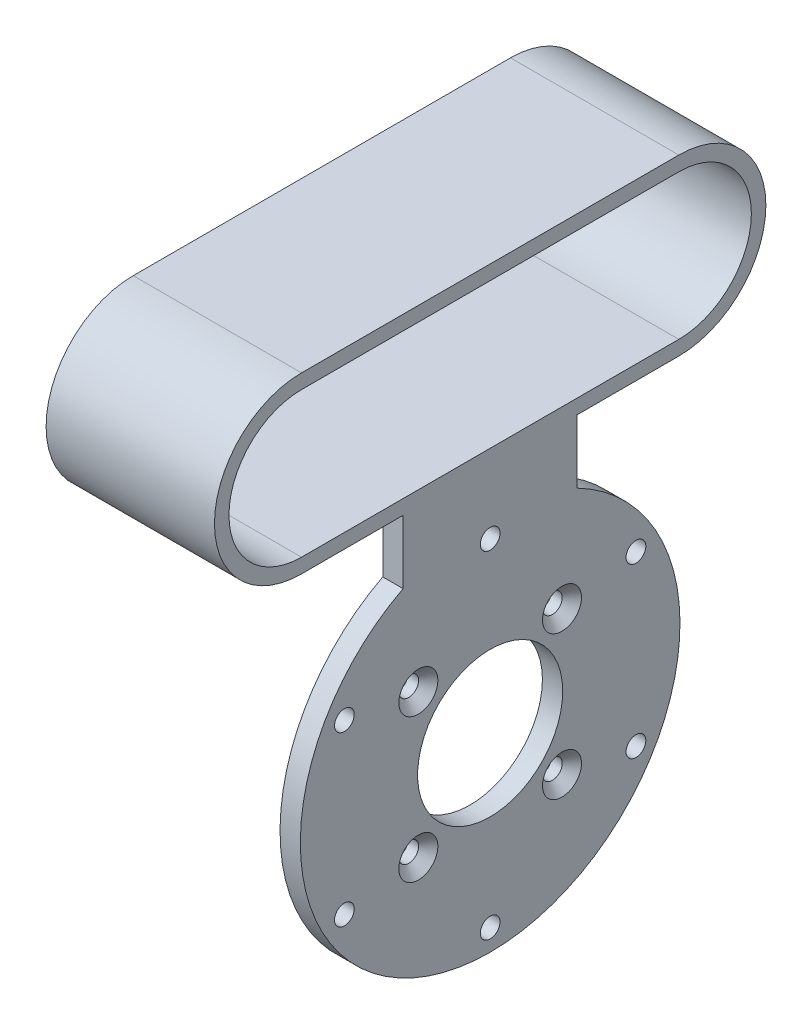
ISO-10303-21;
HEADER;
FILE_DESCRIPTION(('STEP AP214'),'2;1');
FILE_NAME('part.step','',(''),(''),'','','');
FILE_SCHEMA(('AUTOMOTIVE_DESIGN { 1 0 10303 214 1 1 1 1 }'));
ENDSEC;
DATA;
#1=APPLICATION_CONTEXT('core data for automotive mechanical design processes');
#2=APPLICATION_PROTOCOL_DEFINITION('international standard','automotive_design',2000,#1);
#3=PRODUCT_CONTEXT('',#1,'mechanical');
#4=PRODUCT('Part','Part','',(#3));
#5=PRODUCT_RELATED_PRODUCT_CATEGORY('part','',(#4));
#6=PRODUCT_DEFINITION_FORMATION('','',#4);
#7=PRODUCT_DEFINITION_CONTEXT('part definition',#1,'design');
#8=PRODUCT_DEFINITION('design','',#6,#7);
#9=PRODUCT_DEFINITION_SHAPE('','',#8);
#10=(LENGTH_UNIT() NAMED_UNIT(*) SI_UNIT(.MILLI.,.METRE.));
#11=(NAMED_UNIT(*) PLANE_ANGLE_UNIT() SI_UNIT($,.RADIAN.));
#12=(NAMED_UNIT(*) SI_UNIT($,.STERADIAN.) SOLID_ANGLE_UNIT());
#13=UNCERTAINTY_MEASURE_WITH_UNIT(LENGTH_MEASURE(1.E-05),#10,'distance_accuracy_value','');
#14=(GEOMETRIC_REPRESENTATION_CONTEXT(3) GLOBAL_UNCERTAINTY_ASSIGNED_CONTEXT((#13)) GLOBAL_UNIT_ASSIGNED_CONTEXT((#10,
#11,#12)) REPRESENTATION_CONTEXT('',''));
#15=CARTESIAN_POINT('',(0.,0.,0.));
#16=DIRECTION('',(0.,0.,1.));
#17=DIRECTION('',(1.,0.,0.));
#18=AXIS2_PLACEMENT_3D('',#15,#16,#17);
#19=CARTESIAN_POINT('',(3.5,55.,32.5));
#20=DIRECTION('',(-1.,0.,0.));
#21=DIRECTION('',(0.,0.,1.));
#22=AXIS2_PLACEMENT_3D('',#19,#20,#21);
#23=CYLINDRICAL_SURFACE('',#22,12.5);
#24=DIRECTION('',(-1.,0.,0.));
#25=VECTOR('',#24,1.);
#26=CARTESIAN_POINT('',(3.5,42.5,32.5));
#27=LINE('',#26,#25);
#28=CARTESIAN_POINT('',(3.5,42.5,32.5));
#29=VERTEX_POINT('',#28);
#30=CARTESIAN_POINT('',(-22.,42.5,32.5));
#31=VERTEX_POINT('',#30);
#32=EDGE_CURVE('E131',#29,#31,#27,.T.);
#33=ORIENTED_EDGE('',*,*,#32,.T.);
#34=CARTESIAN_POINT('',(-22.,55.,32.5));
#35=DIRECTION('',(-1.,0.,0.));
#36=DIRECTION('',(0.,0.,1.));
#37=AXIS2_PLACEMENT_3D('',#34,#35,#36);
#38=CIRCLE('',#37,12.5);
#39=CARTESIAN_POINT('',(-22.,67.5,32.5));
#40=VERTEX_POINT('',#39);
#41=EDGE_CURVE('E121',#31,#40,#38,.T.);
#42=ORIENTED_EDGE('',*,*,#41,.T.);
#43=DIRECTION('',(-1.,0.,0.));
#44=VECTOR('',#43,1.);
#45=CARTESIAN_POINT('',(3.5,67.5,32.5));
#46=LINE('',#45,#44);
#47=CARTESIAN_POINT('',(3.5,67.5,32.5));
#48=VERTEX_POINT('',#47);
#49=EDGE_CURVE('E128',#48,#40,#46,.T.);
#50=ORIENTED_EDGE('',*,*,#49,.F.);
#51=CARTESIAN_POINT('',(3.5,55.,32.5));
#52=DIRECTION('',(1.,0.,0.));
#53=DIRECTION('',(0.,0.,-1.));
#54=AXIS2_PLACEMENT_3D('',#51,#52,#53);
#55=CIRCLE('',#54,12.5);
#56=EDGE_CURVE('E316',#48,#29,#55,.T.);
#57=ORIENTED_EDGE('',*,*,#56,.T.);
#58=EDGE_LOOP('',(#33,#42,#50,#57));
#59=FACE_BOUND('',#58,.T.);
#60=ADVANCED_FACE('F32',(#59),#23,.F.);
#61=CARTESIAN_POINT('',(3.5,42.5,32.5));
#62=DIRECTION('',(0.,1.,0.));
#63=DIRECTION('',(0.,0.,1.));
#64=AXIS2_PLACEMENT_3D('',#61,#62,#63);
#65=PLANE('',#64);
#66=DIRECTION('',(-1.,0.,0.));
#67=VECTOR('',#66,1.);
#68=CARTESIAN_POINT('',(3.5,42.5,-32.5));
#69=LINE('',#68,#67);
#70=CARTESIAN_POINT('',(3.5,42.5,-32.5));
#71=VERTEX_POINT('',#70);
#72=CARTESIAN_POINT('',(-22.,42.5,-32.5));
#73=VERTEX_POINT('',#72);
#74=EDGE_CURVE('E138',#71,#73,#69,.T.);
#75=ORIENTED_EDGE('',*,*,#74,.T.);
#76=DIRECTION('',(0.,0.,1.));
#77=VECTOR('',#76,1.);
#78=CARTESIAN_POINT('',(-22.,42.5,32.5));
#79=LINE('',#78,#77);
#80=EDGE_CURVE('E234',#73,#31,#79,.T.);
#81=ORIENTED_EDGE('',*,*,#80,.T.);
#82=ORIENTED_EDGE('',*,*,#32,.F.);
#83=DIRECTION('',(0.,0.,-1.));
#84=VECTOR('',#83,1.);
#85=CARTESIAN_POINT('',(3.5,42.5,32.5));
#86=LINE('',#85,#84);
#87=EDGE_CURVE('E318',#29,#71,#86,.T.);
#88=ORIENTED_EDGE('',*,*,#87,.T.);
#89=EDGE_LOOP('',(#75,#81,#82,#88));
#90=FACE_BOUND('',#89,.T.);
#91=ADVANCED_FACE('F326',(#90),#65,.T.);
#92=CARTESIAN_POINT('',(3.5,55.,-32.5));
#93=DIRECTION('',(-1.,0.,0.));
#94=DIRECTION('',(0.,0.,1.));
#95=AXIS2_PLACEMENT_3D('',#92,#93,#94);
#96=CYLINDRICAL_SURFACE('',#95,12.5);
#97=DIRECTION('',(-1.,0.,0.));
#98=VECTOR('',#97,1.);
#99=CARTESIAN_POINT('',(3.5,67.5,-32.5));
#100=LINE('',#99,#98);
#101=CARTESIAN_POINT('',(3.5,67.5,-32.5));
#102=VERTEX_POINT('',#101);
#103=CARTESIAN_POINT('',(-22.,67.5,-32.5));
#104=VERTEX_POINT('',#103);
#105=EDGE_CURVE('E54',#102,#104,#100,.T.);
#106=ORIENTED_EDGE('',*,*,#105,.T.);
#107=CARTESIAN_POINT('',(-22.,55.,-32.5));
#108=DIRECTION('',(-1.,0.,0.));
#109=DIRECTION('',(0.,0.,1.));
#110=AXIS2_PLACEMENT_3D('',#107,#108,#109);
#111=CIRCLE('',#110,12.5);
#112=EDGE_CURVE('E47',#104,#73,#111,.T.);
#113=ORIENTED_EDGE('',*,*,#112,.T.);
#114=ORIENTED_EDGE('',*,*,#74,.F.);
#115=CARTESIAN_POINT('',(3.5,55.,-32.5));
#116=DIRECTION('',(1.,0.,0.));
#117=DIRECTION('',(0.,0.,-1.));
#118=AXIS2_PLACEMENT_3D('',#115,#116,#117);
#119=CIRCLE('',#118,12.5);
#120=EDGE_CURVE('E140',#71,#102,#119,.T.);
#121=ORIENTED_EDGE('',*,*,#120,.T.);
#122=EDGE_LOOP('',(#106,#113,#114,#121));
#123=FACE_BOUND('',#122,.T.);
#124=ADVANCED_FACE('F322',(#123),#96,.F.);
#125=CARTESIAN_POINT('',(3.5,67.5,32.5));
#126=DIRECTION('',(0.,-1.,0.));
#127=DIRECTION('',(0.,0.,-1.));
#128=AXIS2_PLACEMENT_3D('',#125,#126,#127);
#129=PLANE('',#128);
#130=ORIENTED_EDGE('',*,*,#49,.T.);
#131=DIRECTION('',(0.,0.,-1.));
#132=VECTOR('',#131,1.);
#133=CARTESIAN_POINT('',(-22.,67.5,-32.5));
#134=LINE('',#133,#132);
#135=EDGE_CURVE('E118',#40,#104,#134,.T.);
#136=ORIENTED_EDGE('',*,*,#135,.T.);
#137=ORIENTED_EDGE('',*,*,#105,.F.);
#138=DIRECTION('',(0.,0.,1.));
#139=VECTOR('',#138,1.);
#140=CARTESIAN_POINT('',(3.5,67.5,32.5));
#141=LINE('',#140,#139);
#142=EDGE_CURVE('E136',#102,#48,#141,.T.);
#143=ORIENTED_EDGE('',*,*,#142,.T.);
#144=EDGE_LOOP('',(#130,#136,#137,#143));
#145=FACE_BOUND('',#144,.T.);
#146=ADVANCED_FACE('F134',(#145),#129,.T.);
#147=CARTESIAN_POINT('',(3.5,0.,0.));
#148=DIRECTION('',(1.,0.,0.));
#149=DIRECTION('',(0.,0.,-1.));
#150=AXIS2_PLACEMENT_3D('',#147,#148,#149);
#151=PLANE('',#150);
#152=DIRECTION('',(0.,1.,0.));
#153=VECTOR('',#152,1.);
#154=CARTESIAN_POINT('',(3.5,40.,-15.));
#155=LINE('',#154,#153);
#156=CARTESIAN_POINT('',(3.5,29.0566687698366,-15.));
#157=VERTEX_POINT('',#156);
#158=CARTESIAN_POINT('',(3.5,40.,-15.));
#159=VERTEX_POINT('',#158);
#160=EDGE_CURVE('E162',#157,#159,#155,.T.);
#161=ORIENTED_EDGE('',*,*,#160,.T.);
#162=DIRECTION('',(0.,0.,-1.));
#163=VECTOR('',#162,1.);
#164=CARTESIAN_POINT('',(3.5,40.,-32.5));
#165=LINE('',#164,#163);
#166=CARTESIAN_POINT('',(3.5,40.,-32.5));
#167=VERTEX_POINT('',#166);
#168=EDGE_CURVE('E164',#159,#167,#165,.T.);
#169=ORIENTED_EDGE('',*,*,#168,.T.);
#170=CARTESIAN_POINT('',(3.5,55.,-32.5));
#171=DIRECTION('',(1.,0.,0.));
#172=DIRECTION('',(0.,0.,-1.));
#173=AXIS2_PLACEMENT_3D('',#170,#171,#172);
#174=CIRCLE('',#173,15.);
#175=CARTESIAN_POINT('',(3.5,70.,-32.5));
#176=VERTEX_POINT('',#175);
#177=EDGE_CURVE('E166',#167,#176,#174,.T.);
#178=ORIENTED_EDGE('',*,*,#177,.T.);
#179=DIRECTION('',(0.,0.,1.));
#180=VECTOR('',#179,1.);
#181=CARTESIAN_POINT('',(3.5,70.,32.5));
#182=LINE('',#181,#180);
#183=CARTESIAN_POINT('',(3.5,70.,32.5));
#184=VERTEX_POINT('',#183);
#185=EDGE_CURVE('E168',#176,#184,#182,.T.);
#186=ORIENTED_EDGE('',*,*,#185,.T.);
#187=CARTESIAN_POINT('',(3.5,55.,32.5));
#188=DIRECTION('',(1.,0.,0.));
#189=DIRECTION('',(0.,0.,-1.));
#190=AXIS2_PLACEMENT_3D('',#187,#188,#189);
#191=CIRCLE('',#190,15.);
#192=CARTESIAN_POINT('',(3.5,40.,32.5));
#193=VERTEX_POINT('',#192);
#194=EDGE_CURVE('E170',#184,#193,#191,.T.);
#195=ORIENTED_EDGE('',*,*,#194,.T.);
#196=DIRECTION('',(0.,0.,-1.));
#197=VECTOR('',#196,1.);
#198=CARTESIAN_POINT('',(3.5,40.,32.5));
#199=LINE('',#198,#197);
#200=CARTESIAN_POINT('',(3.5,40.,15.));
#201=VERTEX_POINT('',#200);
#202=EDGE_CURVE('E154',#193,#201,#199,.T.);
#203=ORIENTED_EDGE('',*,*,#202,.T.);
#204=DIRECTION('',(0.,-1.,0.));
#205=VECTOR('',#204,1.);
#206=CARTESIAN_POINT('',(3.5,40.,15.));
#207=LINE('',#206,#205);
#208=CARTESIAN_POINT('',(3.5,29.0566687698366,15.));
#209=VERTEX_POINT('',#208);
#210=EDGE_CURVE('E157',#201,#209,#207,.T.);
#211=ORIENTED_EDGE('',*,*,#210,.T.);
#212=CARTESIAN_POINT('',(3.5,0.,0.));
#213=DIRECTION('',(1.,0.,0.));
#214=DIRECTION('',(0.,0.,-1.));
#215=AXIS2_PLACEMENT_3D('',#212,#213,#214);
#216=CIRCLE('',#215,32.7);
#217=EDGE_CURVE('E160',#209,#157,#216,.T.);
#218=ORIENTED_EDGE('',*,*,#217,.T.);
#219=EDGE_LOOP('',(#161,#169,#178,#186,#195,#203,#211,#218));
#220=FACE_BOUND('',#219,.T.);
#221=CARTESIAN_POINT('',(3.5,12.3743686707646,-12.3743686707646));
#222=DIRECTION('',(1.,0.,0.));
#223=DIRECTION('',(0.,0.,-1.));
#224=AXIS2_PLACEMENT_3D('',#221,#222,#223);
#225=CIRCLE('',#224,3.36);
#226=CARTESIAN_POINT('',(3.5,12.3743686707646,-15.7343686707646));
#227=VERTEX_POINT('',#226);
#228=EDGE_CURVE('E240',#227,#227,#225,.T.);
#229=ORIENTED_EDGE('',*,*,#228,.F.);
#230=EDGE_LOOP('',(#229));
#231=FACE_BOUND('',#230,.T.);
#232=CARTESIAN_POINT('',(3.5,-12.3743686707646,12.3743686707646));
#233=DIRECTION('',(1.,0.,0.));
#234=DIRECTION('',(0.,0.,-1.));
#235=AXIS2_PLACEMENT_3D('',#232,#233,#234);
#236=CIRCLE('',#235,3.36);
#237=CARTESIAN_POINT('',(3.5,-12.3743686707646,9.01436867076458));
#238=VERTEX_POINT('',#237);
#239=EDGE_CURVE('E253',#238,#238,#236,.T.);
#240=ORIENTED_EDGE('',*,*,#239,.F.);
#241=EDGE_LOOP('',(#240));
#242=FACE_BOUND('',#241,.T.);
#243=CARTESIAN_POINT('',(3.5,12.3743686707646,12.3743686707646));
#244=DIRECTION('',(1.,0.,0.));
#245=DIRECTION('',(0.,0.,-1.));
#246=AXIS2_PLACEMENT_3D('',#243,#244,#245);
#247=CIRCLE('',#246,3.36);
#248=CARTESIAN_POINT('',(3.5,12.3743686707646,9.01436867076458));
#249=VERTEX_POINT('',#248);
#250=EDGE_CURVE('E262',#249,#249,#247,.T.);
#251=ORIENTED_EDGE('',*,*,#250,.F.);
#252=EDGE_LOOP('',(#251));
#253=FACE_BOUND('',#252,.T.);
#254=CARTESIAN_POINT('',(3.5,-12.3743686707646,-12.3743686707646));
#255=DIRECTION('',(1.,0.,0.));
#256=DIRECTION('',(0.,0.,-1.));
#257=AXIS2_PLACEMENT_3D('',#254,#255,#256);
#258=CIRCLE('',#257,3.36);
#259=CARTESIAN_POINT('',(3.5,-12.3743686707646,-15.7343686707646));
#260=VERTEX_POINT('',#259);
#261=EDGE_CURVE('E271',#260,#260,#258,.T.);
#262=ORIENTED_EDGE('',*,*,#261,.F.);
#263=EDGE_LOOP('',(#262));
#264=FACE_BOUND('',#263,.T.);
#265=CARTESIAN_POINT('',(3.5,29.,0.));
#266=DIRECTION('',(1.,0.,0.));
#267=DIRECTION('',(0.,0.,-1.));
#268=AXIS2_PLACEMENT_3D('',#265,#266,#267);
#269=CIRCLE('',#268,1.69999999999999);
#270=CARTESIAN_POINT('',(3.5,29.,-1.69999999999999));
#271=VERTEX_POINT('',#270);
#272=EDGE_CURVE('E280',#271,#271,#269,.T.);
#273=ORIENTED_EDGE('',*,*,#272,.F.);
#274=EDGE_LOOP('',(#273));
#275=FACE_BOUND('',#274,.T.);
#276=CARTESIAN_POINT('',(3.5,14.5,-25.1147367097487));
#277=DIRECTION('',(1.,0.,0.));
#278=DIRECTION('',(0.,0.,-1.));
#279=AXIS2_PLACEMENT_3D('',#276,#277,#278);
#280=CIRCLE('',#279,1.69999999999999);
#281=CARTESIAN_POINT('',(3.5,14.5,-26.8147367097487));
#282=VERTEX_POINT('',#281);
#283=EDGE_CURVE('E286',#282,#282,#280,.T.);
#284=ORIENTED_EDGE('',*,*,#283,.F.);
#285=EDGE_LOOP('',(#284));
#286=FACE_BOUND('',#285,.T.);
#287=CARTESIAN_POINT('',(3.5,-14.5,-25.1147367097487));
#288=DIRECTION('',(1.,0.,0.));
#289=DIRECTION('',(0.,0.,-1.));
#290=AXIS2_PLACEMENT_3D('',#287,#288,#289);
#291=CIRCLE('',#290,1.69999999999999);
#292=CARTESIAN_POINT('',(3.5,-14.5,-26.8147367097487));
#293=VERTEX_POINT('',#292);
#294=EDGE_CURVE('E292',#293,#293,#291,.T.);
#295=ORIENTED_EDGE('',*,*,#294,.F.);
#296=EDGE_LOOP('',(#295));
#297=FACE_BOUND('',#296,.T.);
#298=CARTESIAN_POINT('',(3.5,-29.,0.));
#299=DIRECTION('',(1.,0.,0.));
#300=DIRECTION('',(0.,0.,-1.));
#301=AXIS2_PLACEMENT_3D('',#298,#299,#300);
#302=CIRCLE('',#301,1.69999999999999);
#303=CARTESIAN_POINT('',(3.5,-29.,-1.69999999999999));
#304=VERTEX_POINT('',#303);
#305=EDGE_CURVE('E298',#304,#304,#302,.T.);
#306=ORIENTED_EDGE('',*,*,#305,.F.);
#307=EDGE_LOOP('',(#306));
#308=FACE_BOUND('',#307,.T.);
#309=CARTESIAN_POINT('',(3.5,-14.5,25.1147367097487));
#310=DIRECTION('',(1.,0.,0.));
#311=DIRECTION('',(0.,0.,-1.));
#312=AXIS2_PLACEMENT_3D('',#309,#310,#311);
#313=CIRCLE('',#312,1.69999999999999);
#314=CARTESIAN_POINT('',(3.5,-14.5,23.4147367097487));
#315=VERTEX_POINT('',#314);
#316=EDGE_CURVE('E304',#315,#315,#313,.T.);
#317=ORIENTED_EDGE('',*,*,#316,.F.);
#318=EDGE_LOOP('',(#317));
#319=FACE_BOUND('',#318,.T.);
#320=CARTESIAN_POINT('',(3.5,14.5,25.1147367097487));
#321=DIRECTION('',(1.,0.,0.));
#322=DIRECTION('',(0.,0.,-1.));
#323=AXIS2_PLACEMENT_3D('',#320,#321,#322);
#324=CIRCLE('',#323,1.69999999999999);
#325=CARTESIAN_POINT('',(3.5,14.5,23.4147367097487));
#326=VERTEX_POINT('',#325);
#327=EDGE_CURVE('E310',#326,#326,#324,.T.);
#328=ORIENTED_EDGE('',*,*,#327,.F.);
#329=EDGE_LOOP('',(#328));
#330=FACE_BOUND('',#329,.T.);
#331=CARTESIAN_POINT('',(3.5,0.,0.));
#332=DIRECTION('',(1.,0.,0.));
#333=DIRECTION('',(0.,0.,-1.));
#334=AXIS2_PLACEMENT_3D('',#331,#332,#333);
#335=CIRCLE('',#334,12.5);
#336=CARTESIAN_POINT('',(3.5,0.,-12.5));
#337=VERTEX_POINT('',#336);
#338=EDGE_CURVE('E148',#337,#337,#335,.T.);
#339=ORIENTED_EDGE('',*,*,#338,.F.);
#340=EDGE_LOOP('',(#339));
#341=FACE_BOUND('',#340,.T.);
#342=ORIENTED_EDGE('',*,*,#87,.F.);
#343=ORIENTED_EDGE('',*,*,#56,.F.);
#344=ORIENTED_EDGE('',*,*,#142,.F.);
#345=ORIENTED_EDGE('',*,*,#120,.F.);
#346=EDGE_LOOP('',(#342,#343,#344,#345));
#347=FACE_BOUND('',#346,.T.);
#348=ADVANCED_FACE('F215',(#220,#231,#242,#253,#264,#275,#286,#297,#308,#319,#330,#341,#347),
#151,.T.);
#349=CARTESIAN_POINT('',(0.,0.,0.));
#350=DIRECTION('',(1.,0.,0.));
#351=DIRECTION('',(0.,0.,-1.));
#352=AXIS2_PLACEMENT_3D('',#349,#350,#351);
#353=PLANE('',#352);
#354=CARTESIAN_POINT('',(0.,12.3743686707646,-12.3743686707646));
#355=DIRECTION('',(1.,0.,0.));
#356=DIRECTION('',(0.,0.,-1.));
#357=AXIS2_PLACEMENT_3D('',#354,#355,#356);
#358=CIRCLE('',#357,1.7);
#359=CARTESIAN_POINT('',(0.,12.3743686707646,-14.0743686707646));
#360=VERTEX_POINT('',#359);
#361=EDGE_CURVE('E250',#360,#360,#358,.T.);
#362=ORIENTED_EDGE('',*,*,#361,.T.);
#363=EDGE_LOOP('',(#362));
#364=FACE_BOUND('',#363,.T.);
#365=CARTESIAN_POINT('',(0.,-12.3743686707646,12.3743686707646));
#366=DIRECTION('',(1.,0.,0.));
#367=DIRECTION('',(0.,0.,-1.));
#368=AXIS2_PLACEMENT_3D('',#365,#366,#367);
#369=CIRCLE('',#368,1.7);
#370=CARTESIAN_POINT('',(0.,-12.3743686707646,10.6743686707646));
#371=VERTEX_POINT('',#370);
#372=EDGE_CURVE('E259',#371,#371,#369,.T.);
#373=ORIENTED_EDGE('',*,*,#372,.T.);
#374=EDGE_LOOP('',(#373));
#375=FACE_BOUND('',#374,.T.);
#376=CARTESIAN_POINT('',(0.,12.3743686707646,12.3743686707646));
#377=DIRECTION('',(1.,0.,0.));
#378=DIRECTION('',(0.,0.,-1.));
#379=AXIS2_PLACEMENT_3D('',#376,#377,#378);
#380=CIRCLE('',#379,1.7);
#381=CARTESIAN_POINT('',(0.,12.3743686707646,10.6743686707646));
#382=VERTEX_POINT('',#381);
#383=EDGE_CURVE('E268',#382,#382,#380,.T.);
#384=ORIENTED_EDGE('',*,*,#383,.T.);
#385=EDGE_LOOP('',(#384));
#386=FACE_BOUND('',#385,.T.);
#387=CARTESIAN_POINT('',(0.,-12.3743686707646,-12.3743686707646));
#388=DIRECTION('',(1.,0.,0.));
#389=DIRECTION('',(0.,0.,-1.));
#390=AXIS2_PLACEMENT_3D('',#387,#388,#389);
#391=CIRCLE('',#390,1.7);
#392=CARTESIAN_POINT('',(0.,-12.3743686707646,-14.0743686707646));
#393=VERTEX_POINT('',#392);
#394=EDGE_CURVE('E277',#393,#393,#391,.T.);
#395=ORIENTED_EDGE('',*,*,#394,.T.);
#396=EDGE_LOOP('',(#395));
#397=FACE_BOUND('',#396,.T.);
#398=CARTESIAN_POINT('',(0.,29.,0.));
#399=DIRECTION('',(1.,0.,0.));
#400=DIRECTION('',(0.,0.,-1.));
#401=AXIS2_PLACEMENT_3D('',#398,#399,#400);
#402=CIRCLE('',#401,1.69999999999999);
#403=CARTESIAN_POINT('',(0.,29.,-1.69999999999999));
#404=VERTEX_POINT('',#403);
#405=EDGE_CURVE('E283',#404,#404,#402,.T.);
#406=ORIENTED_EDGE('',*,*,#405,.T.);
#407=EDGE_LOOP('',(#406));
#408=FACE_BOUND('',#407,.T.);
#409=CARTESIAN_POINT('',(0.,14.5,-25.1147367097487));
#410=DIRECTION('',(1.,0.,0.));
#411=DIRECTION('',(0.,0.,-1.));
#412=AXIS2_PLACEMENT_3D('',#409,#410,#411);
#413=CIRCLE('',#412,1.69999999999999);
#414=CARTESIAN_POINT('',(0.,14.5,-26.8147367097487));
#415=VERTEX_POINT('',#414);
#416=EDGE_CURVE('E289',#415,#415,#413,.T.);
#417=ORIENTED_EDGE('',*,*,#416,.T.);
#418=EDGE_LOOP('',(#417));
#419=FACE_BOUND('',#418,.T.);
#420=CARTESIAN_POINT('',(0.,-14.5,-25.1147367097487));
#421=DIRECTION('',(1.,0.,0.));
#422=DIRECTION('',(0.,0.,-1.));
#423=AXIS2_PLACEMENT_3D('',#420,#421,#422);
#424=CIRCLE('',#423,1.69999999999999);
#425=CARTESIAN_POINT('',(0.,-14.5,-26.8147367097487));
#426=VERTEX_POINT('',#425);
#427=EDGE_CURVE('E295',#426,#426,#424,.T.);
#428=ORIENTED_EDGE('',*,*,#427,.T.);
#429=EDGE_LOOP('',(#428));
#430=FACE_BOUND('',#429,.T.);
#431=CARTESIAN_POINT('',(0.,-29.,0.));
#432=DIRECTION('',(1.,0.,0.));
#433=DIRECTION('',(0.,0.,-1.));
#434=AXIS2_PLACEMENT_3D('',#431,#432,#433);
#435=CIRCLE('',#434,1.69999999999999);
#436=CARTESIAN_POINT('',(0.,-29.,-1.69999999999999));
#437=VERTEX_POINT('',#436);
#438=EDGE_CURVE('E301',#437,#437,#435,.T.);
#439=ORIENTED_EDGE('',*,*,#438,.T.);
#440=EDGE_LOOP('',(#439));
#441=FACE_BOUND('',#440,.T.);
#442=CARTESIAN_POINT('',(0.,-14.5,25.1147367097487));
#443=DIRECTION('',(1.,0.,0.));
#444=DIRECTION('',(0.,0.,-1.));
#445=AXIS2_PLACEMENT_3D('',#442,#443,#444);
#446=CIRCLE('',#445,1.69999999999999);
#447=CARTESIAN_POINT('',(0.,-14.5,23.4147367097487));
#448=VERTEX_POINT('',#447);
#449=EDGE_CURVE('E307',#448,#448,#446,.T.);
#450=ORIENTED_EDGE('',*,*,#449,.T.);
#451=EDGE_LOOP('',(#450));
#452=FACE_BOUND('',#451,.T.);
#453=CARTESIAN_POINT('',(0.,14.5,25.1147367097487));
#454=DIRECTION('',(1.,0.,0.));
#455=DIRECTION('',(0.,0.,-1.));
#456=AXIS2_PLACEMENT_3D('',#453,#454,#455);
#457=CIRCLE('',#456,1.69999999999999);
#458=CARTESIAN_POINT('',(0.,14.5,23.4147367097487));
#459=VERTEX_POINT('',#458);
#460=EDGE_CURVE('E313',#459,#459,#457,.T.);
#461=ORIENTED_EDGE('',*,*,#460,.T.);
#462=EDGE_LOOP('',(#461));
#463=FACE_BOUND('',#462,.T.);
#464=CARTESIAN_POINT('',(0.,0.,0.));
#465=DIRECTION('',(1.,0.,0.));
#466=DIRECTION('',(0.,0.,-1.));
#467=AXIS2_PLACEMENT_3D('',#464,#465,#466);
#468=CIRCLE('',#467,12.5);
#469=CARTESIAN_POINT('',(0.,0.,-12.5));
#470=VERTEX_POINT('',#469);
#471=EDGE_CURVE('E147',#470,#470,#468,.T.);
#472=ORIENTED_EDGE('',*,*,#471,.T.);
#473=EDGE_LOOP('',(#472));
#474=FACE_BOUND('',#473,.T.);
#475=DIRECTION('',(0.,-1.,0.));
#476=VECTOR('',#475,1.);
#477=CARTESIAN_POINT('',(0.,40.,15.));
#478=LINE('',#477,#476);
#479=CARTESIAN_POINT('',(0.,40.,15.));
#480=VERTEX_POINT('',#479);
#481=CARTESIAN_POINT('',(0.,29.0566687698366,15.));
#482=VERTEX_POINT('',#481);
#483=EDGE_CURVE('E151',#480,#482,#478,.T.);
#484=ORIENTED_EDGE('',*,*,#483,.F.);
#485=DIRECTION('',(0.,0.,-1.));
#486=VECTOR('',#485,1.);
#487=CARTESIAN_POINT('',(0.,40.,0.));
#488=LINE('',#487,#486);
#489=CARTESIAN_POINT('',(0.,40.,-15.));
#490=VERTEX_POINT('',#489);
#491=EDGE_CURVE('E202',#480,#490,#488,.T.);
#492=ORIENTED_EDGE('',*,*,#491,.T.);
#493=DIRECTION('',(0.,1.,0.));
#494=VECTOR('',#493,1.);
#495=CARTESIAN_POINT('',(0.,40.,-15.));
#496=LINE('',#495,#494);
#497=CARTESIAN_POINT('',(0.,29.0566687698366,-15.));
#498=VERTEX_POINT('',#497);
#499=EDGE_CURVE('E158',#498,#490,#496,.T.);
#500=ORIENTED_EDGE('',*,*,#499,.F.);
#501=CARTESIAN_POINT('',(0.,0.,0.));
#502=DIRECTION('',(1.,0.,0.));
#503=DIRECTION('',(0.,0.,-1.));
#504=AXIS2_PLACEMENT_3D('',#501,#502,#503);
#505=CIRCLE('',#504,32.7);
#506=EDGE_CURVE('E174',#482,#498,#505,.T.);
#507=ORIENTED_EDGE('',*,*,#506,.F.);
#508=EDGE_LOOP('',(#484,#492,#500,#507));
#509=FACE_BOUND('',#508,.T.);
#510=ADVANCED_FACE('F201',(#364,#375,#386,#397,#408,#419,#430,#441,#452,#463,#474,#509),#353,.F.);
#511=CARTESIAN_POINT('',(3.5,40.,15.));
#512=DIRECTION('',(0.,0.,-1.));
#513=DIRECTION('',(0.,1.,0.));
#514=AXIS2_PLACEMENT_3D('',#511,#512,#513);
#515=PLANE('',#514);
#516=ORIENTED_EDGE('',*,*,#483,.T.);
#517=DIRECTION('',(-1.,0.,0.));
#518=VECTOR('',#517,1.);
#519=CARTESIAN_POINT('',(3.5,29.0566687698366,15.));
#520=LINE('',#519,#518);
#521=EDGE_CURVE('E40',#209,#482,#520,.T.);
#522=ORIENTED_EDGE('',*,*,#521,.F.);
#523=ORIENTED_EDGE('',*,*,#210,.F.);
#524=DIRECTION('',(-1.,0.,0.));
#525=VECTOR('',#524,1.);
#526=CARTESIAN_POINT('',(3.5,40.,15.));
#527=LINE('',#526,#525);
#528=EDGE_CURVE('E11',#201,#480,#527,.T.);
#529=ORIENTED_EDGE('',*,*,#528,.T.);
#530=EDGE_LOOP('',(#516,#522,#523,#529));
#531=FACE_BOUND('',#530,.T.);
#532=ADVANCED_FACE('F34',(#531),#515,.F.);
#533=CARTESIAN_POINT('',(3.5,0.,0.));
#534=DIRECTION('',(-1.,0.,0.));
#535=DIRECTION('',(0.,0.,1.));
#536=AXIS2_PLACEMENT_3D('',#533,#534,#535);
#537=CYLINDRICAL_SURFACE('',#536,32.7);
#538=ORIENTED_EDGE('',*,*,#506,.T.);
#539=DIRECTION('',(-1.,0.,0.));
#540=VECTOR('',#539,1.);
#541=CARTESIAN_POINT('',(3.5,29.0566687698366,-15.));
#542=LINE('',#541,#540);
#543=EDGE_CURVE('E188',#157,#498,#542,.T.);
#544=ORIENTED_EDGE('',*,*,#543,.F.);
#545=ORIENTED_EDGE('',*,*,#217,.F.);
#546=ORIENTED_EDGE('',*,*,#521,.T.);
#547=EDGE_LOOP('',(#538,#544,#545,#546));
#548=FACE_BOUND('',#547,.T.);
#549=ADVANCED_FACE('F195',(#548),#537,.T.);
#550=CARTESIAN_POINT('',(3.5,40.,-15.));
#551=DIRECTION('',(0.,0.,1.));
#552=DIRECTION('',(0.,-1.,0.));
#553=AXIS2_PLACEMENT_3D('',#550,#551,#552);
#554=PLANE('',#553);
#555=ORIENTED_EDGE('',*,*,#499,.T.);
#556=DIRECTION('',(-1.,0.,0.));
#557=VECTOR('',#556,1.);
#558=CARTESIAN_POINT('',(3.5,40.,-15.));
#559=LINE('',#558,#557);
#560=EDGE_CURVE('E185',#159,#490,#559,.T.);
#561=ORIENTED_EDGE('',*,*,#560,.F.);
#562=ORIENTED_EDGE('',*,*,#160,.F.);
#563=ORIENTED_EDGE('',*,*,#543,.T.);
#564=EDGE_LOOP('',(#555,#561,#562,#563));
#565=FACE_BOUND('',#564,.T.);
#566=ADVANCED_FACE('F205',(#565),#554,.F.);
#567=CARTESIAN_POINT('',(3.5,40.,-32.5));
#568=DIRECTION('',(0.,1.,0.));
#569=DIRECTION('',(0.,0.,1.));
#570=AXIS2_PLACEMENT_3D('',#567,#568,#569);
#571=PLANE('',#570);
#572=ORIENTED_EDGE('',*,*,#560,.T.);
#573=ORIENTED_EDGE('',*,*,#491,.F.);
#574=ORIENTED_EDGE('',*,*,#528,.F.);
#575=ORIENTED_EDGE('',*,*,#202,.F.);
#576=DIRECTION('',(-1.,0.,0.));
#577=VECTOR('',#576,1.);
#578=CARTESIAN_POINT('',(3.5,40.,32.5));
#579=LINE('',#578,#577);
#580=CARTESIAN_POINT('',(-25.5,40.,32.5));
#581=VERTEX_POINT('',#580);
#582=EDGE_CURVE('E172',#193,#581,#579,.T.);
#583=ORIENTED_EDGE('',*,*,#582,.T.);
#584=DIRECTION('',(0.,0.,-1.));
#585=VECTOR('',#584,1.);
#586=CARTESIAN_POINT('',(-25.5,40.,-15.));
#587=LINE('',#586,#585);
#588=CARTESIAN_POINT('',(-25.5,40.,-32.5));
#589=VERTEX_POINT('',#588);
#590=EDGE_CURVE('E221',#581,#589,#587,.T.);
#591=ORIENTED_EDGE('',*,*,#590,.T.);
#592=DIRECTION('',(-1.,0.,0.));
#593=VECTOR('',#592,1.);
#594=CARTESIAN_POINT('',(3.5,40.,-32.5));
#595=LINE('',#594,#593);
#596=EDGE_CURVE('E183',#167,#589,#595,.T.);
#597=ORIENTED_EDGE('',*,*,#596,.F.);
#598=ORIENTED_EDGE('',*,*,#168,.F.);
#599=EDGE_LOOP('',(#572,#573,#574,#575,#583,#591,#597,#598));
#600=FACE_BOUND('',#599,.T.);
#601=ADVANCED_FACE('F209',(#600),#571,.F.);
#602=CARTESIAN_POINT('',(3.5,55.,-32.5));
#603=DIRECTION('',(-1.,0.,0.));
#604=DIRECTION('',(0.,0.,1.));
#605=AXIS2_PLACEMENT_3D('',#602,#603,#604);
#606=CYLINDRICAL_SURFACE('',#605,15.);
#607=ORIENTED_EDGE('',*,*,#596,.T.);
#608=CARTESIAN_POINT('',(-25.5,55.,-32.5));
#609=DIRECTION('',(1.,0.,0.));
#610=DIRECTION('',(0.,0.,-1.));
#611=AXIS2_PLACEMENT_3D('',#608,#609,#610);
#612=CIRCLE('',#611,15.);
#613=CARTESIAN_POINT('',(-25.5,70.,-32.5));
#614=VERTEX_POINT('',#613);
#615=EDGE_CURVE('E233',#589,#614,#612,.T.);
#616=ORIENTED_EDGE('',*,*,#615,.T.);
#617=DIRECTION('',(-1.,0.,0.));
#618=VECTOR('',#617,1.);
#619=CARTESIAN_POINT('',(3.5,70.,-32.5));
#620=LINE('',#619,#618);
#621=EDGE_CURVE('E181',#176,#614,#620,.T.);
#622=ORIENTED_EDGE('',*,*,#621,.F.);
#623=ORIENTED_EDGE('',*,*,#177,.F.);
#624=EDGE_LOOP('',(#607,#616,#622,#623));
#625=FACE_BOUND('',#624,.T.);
#626=ADVANCED_FACE('F330',(#625),#606,.T.);
#627=CARTESIAN_POINT('',(3.5,70.,32.5));
#628=DIRECTION('',(0.,-1.,0.));
#629=DIRECTION('',(0.,0.,-1.));
#630=AXIS2_PLACEMENT_3D('',#627,#628,#629);
#631=PLANE('',#630);
#632=ORIENTED_EDGE('',*,*,#621,.T.);
#633=DIRECTION('',(0.,0.,1.));
#634=VECTOR('',#633,1.);
#635=CARTESIAN_POINT('',(-25.5,70.,-32.5));
#636=LINE('',#635,#634);
#637=CARTESIAN_POINT('',(-25.5,70.,32.5));
#638=VERTEX_POINT('',#637);
#639=EDGE_CURVE('E238',#614,#638,#636,.T.);
#640=ORIENTED_EDGE('',*,*,#639,.T.);
#641=DIRECTION('',(-1.,0.,0.));
#642=VECTOR('',#641,1.);
#643=CARTESIAN_POINT('',(3.5,70.,32.5));
#644=LINE('',#643,#642);
#645=EDGE_CURVE('E179',#184,#638,#644,.T.);
#646=ORIENTED_EDGE('',*,*,#645,.F.);
#647=ORIENTED_EDGE('',*,*,#185,.F.);
#648=EDGE_LOOP('',(#632,#640,#646,#647));
#649=FACE_BOUND('',#648,.T.);
#650=ADVANCED_FACE('F333',(#649),#631,.F.);
#651=CARTESIAN_POINT('',(3.5,55.,32.5));
#652=DIRECTION('',(-1.,0.,0.));
#653=DIRECTION('',(0.,0.,1.));
#654=AXIS2_PLACEMENT_3D('',#651,#652,#653);
#655=CYLINDRICAL_SURFACE('',#654,15.);
#656=ORIENTED_EDGE('',*,*,#645,.T.);
#657=CARTESIAN_POINT('',(-25.5,55.,32.5));
#658=DIRECTION('',(1.,0.,0.));
#659=DIRECTION('',(0.,0.,-1.));
#660=AXIS2_PLACEMENT_3D('',#657,#658,#659);
#661=CIRCLE('',#660,15.);
#662=EDGE_CURVE('E230',#638,#581,#661,.T.);
#663=ORIENTED_EDGE('',*,*,#662,.T.);
#664=ORIENTED_EDGE('',*,*,#582,.F.);
#665=ORIENTED_EDGE('',*,*,#194,.F.);
#666=EDGE_LOOP('',(#656,#663,#664,#665));
#667=FACE_BOUND('',#666,.T.);
#668=ADVANCED_FACE('F236',(#667),#655,.T.);
#669=CARTESIAN_POINT('',(3.5,0.,0.));
#670=DIRECTION('',(-1.,0.,0.));
#671=DIRECTION('',(0.,0.,1.));
#672=AXIS2_PLACEMENT_3D('',#669,#670,#671);
#673=CYLINDRICAL_SURFACE('',#672,12.5);
#674=ORIENTED_EDGE('',*,*,#338,.T.);
#675=EDGE_LOOP('',(#674));
#676=FACE_BOUND('',#675,.T.);
#677=ORIENTED_EDGE('',*,*,#471,.F.);
#678=EDGE_LOOP('',(#677));
#679=FACE_BOUND('',#678,.T.);
#680=ADVANCED_FACE('F340',(#676,#679),#673,.F.);
#681=CARTESIAN_POINT('',(3.5,14.5,25.1147367097487));
#682=DIRECTION('',(1.,0.,0.));
#683=DIRECTION('',(0.,0.,-1.));
#684=AXIS2_PLACEMENT_3D('',#681,#682,#683);
#685=CYLINDRICAL_SURFACE('',#684,1.69999999999999);
#686=ORIENTED_EDGE('',*,*,#460,.F.);
#687=EDGE_LOOP('',(#686));
#688=FACE_BOUND('',#687,.T.);
#689=ORIENTED_EDGE('',*,*,#327,.T.);
#690=EDGE_LOOP('',(#689));
#691=FACE_BOUND('',#690,.T.);
#692=ADVANCED_FACE('F353',(#688,#691),#685,.F.);
#693=CARTESIAN_POINT('',(3.5,-14.5,25.1147367097487));
#694=DIRECTION('',(1.,0.,0.));
#695=DIRECTION('',(0.,0.,-1.));
#696=AXIS2_PLACEMENT_3D('',#693,#694,#695);
#697=CYLINDRICAL_SURFACE('',#696,1.69999999999999);
#698=ORIENTED_EDGE('',*,*,#449,.F.);
#699=EDGE_LOOP('',(#698));
#700=FACE_BOUND('',#699,.T.);
#701=ORIENTED_EDGE('',*,*,#316,.T.);
#702=EDGE_LOOP('',(#701));
#703=FACE_BOUND('',#702,.T.);
#704=ADVANCED_FACE('F387',(#700,#703),#697,.F.);
#705=CARTESIAN_POINT('',(3.5,-29.,0.));
#706=DIRECTION('',(1.,0.,0.));
#707=DIRECTION('',(0.,0.,-1.));
#708=AXIS2_PLACEMENT_3D('',#705,#706,#707);
#709=CYLINDRICAL_SURFACE('',#708,1.69999999999999);
#710=ORIENTED_EDGE('',*,*,#438,.F.);
#711=EDGE_LOOP('',(#710));
#712=FACE_BOUND('',#711,.T.);
#713=ORIENTED_EDGE('',*,*,#305,.T.);
#714=EDGE_LOOP('',(#713));
#715=FACE_BOUND('',#714,.T.);
#716=ADVANCED_FACE('F396',(#712,#715),#709,.F.);
#717=CARTESIAN_POINT('',(3.5,-14.5,-25.1147367097487));
#718=DIRECTION('',(1.,0.,0.));
#719=DIRECTION('',(0.,0.,-1.));
#720=AXIS2_PLACEMENT_3D('',#717,#718,#719);
#721=CYLINDRICAL_SURFACE('',#720,1.69999999999999);
#722=ORIENTED_EDGE('',*,*,#427,.F.);
#723=EDGE_LOOP('',(#722));
#724=FACE_BOUND('',#723,.T.);
#725=ORIENTED_EDGE('',*,*,#294,.T.);
#726=EDGE_LOOP('',(#725));
#727=FACE_BOUND('',#726,.T.);
#728=ADVANCED_FACE('F650',(#724,#727),#721,.F.);
#729=CARTESIAN_POINT('',(3.5,14.5,-25.1147367097487));
#730=DIRECTION('',(1.,0.,0.));
#731=DIRECTION('',(0.,0.,-1.));
#732=AXIS2_PLACEMENT_3D('',#729,#730,#731);
#733=CYLINDRICAL_SURFACE('',#732,1.69999999999999);
#734=ORIENTED_EDGE('',*,*,#416,.F.);
#735=EDGE_LOOP('',(#734));
#736=FACE_BOUND('',#735,.T.);
#737=ORIENTED_EDGE('',*,*,#283,.T.);
#738=EDGE_LOOP('',(#737));
#739=FACE_BOUND('',#738,.T.);
#740=ADVANCED_FACE('F642',(#736,#739),#733,.F.);
#741=CARTESIAN_POINT('',(3.5,29.,0.));
#742=DIRECTION('',(1.,0.,0.));
#743=DIRECTION('',(0.,0.,-1.));
#744=AXIS2_PLACEMENT_3D('',#741,#742,#743);
#745=CYLINDRICAL_SURFACE('',#744,1.69999999999999);
#746=ORIENTED_EDGE('',*,*,#405,.F.);
#747=EDGE_LOOP('',(#746));
#748=FACE_BOUND('',#747,.T.);
#749=ORIENTED_EDGE('',*,*,#272,.T.);
#750=EDGE_LOOP('',(#749));
#751=FACE_BOUND('',#750,.T.);
#752=ADVANCED_FACE('F634',(#748,#751),#745,.F.);
#753=CARTESIAN_POINT('',(3.5,-12.3743686707646,-12.3743686707646));
#754=DIRECTION('',(1.,0.,0.));
#755=DIRECTION('',(0.,0.,-1.));
#756=AXIS2_PLACEMENT_3D('',#753,#754,#755);
#757=CYLINDRICAL_SURFACE('',#756,1.7);
#758=ORIENTED_EDGE('',*,*,#394,.F.);
#759=EDGE_LOOP('',(#758));
#760=FACE_BOUND('',#759,.T.);
#761=CARTESIAN_POINT('',(1.84,-12.3743686707646,-12.3743686707646));
#762=DIRECTION('',(1.,0.,0.));
#763=DIRECTION('',(0.,0.,-1.));
#764=AXIS2_PLACEMENT_3D('',#761,#762,#763);
#765=CIRCLE('',#764,1.7);
#766=CARTESIAN_POINT('',(1.84,-12.3743686707646,-14.0743686707646));
#767=VERTEX_POINT('',#766);
#768=EDGE_CURVE('E274',#767,#767,#765,.T.);
#769=ORIENTED_EDGE('',*,*,#768,.T.);
#770=EDGE_LOOP('',(#769));
#771=FACE_BOUND('',#770,.T.);
#772=ADVANCED_FACE('F626',(#760,#771),#757,.F.);
#773=CARTESIAN_POINT('',(3.5,-12.3743686707646,-12.3743686707646));
#774=DIRECTION('',(1.,0.,0.));
#775=DIRECTION('',(0.,0.,-1.));
#776=AXIS2_PLACEMENT_3D('',#773,#774,#775);
#777=CONICAL_SURFACE('',#776,3.36,0.785398163397448);
#778=ORIENTED_EDGE('',*,*,#768,.F.);
#779=EDGE_LOOP('',(#778));
#780=FACE_BOUND('',#779,.T.);
#781=ORIENTED_EDGE('',*,*,#261,.T.);
#782=EDGE_LOOP('',(#781));
#783=FACE_BOUND('',#782,.T.);
#784=ADVANCED_FACE('F618',(#780,#783),#777,.F.);
#785=CARTESIAN_POINT('',(3.5,12.3743686707646,12.3743686707646));
#786=DIRECTION('',(1.,0.,0.));
#787=DIRECTION('',(0.,0.,-1.));
#788=AXIS2_PLACEMENT_3D('',#785,#786,#787);
#789=CYLINDRICAL_SURFACE('',#788,1.7);
#790=ORIENTED_EDGE('',*,*,#383,.F.);
#791=EDGE_LOOP('',(#790));
#792=FACE_BOUND('',#791,.T.);
#793=CARTESIAN_POINT('',(1.84,12.3743686707646,12.3743686707646));
#794=DIRECTION('',(1.,0.,0.));
#795=DIRECTION('',(0.,0.,-1.));
#796=AXIS2_PLACEMENT_3D('',#793,#794,#795);
#797=CIRCLE('',#796,1.7);
#798=CARTESIAN_POINT('',(1.84,12.3743686707646,10.6743686707646));
#799=VERTEX_POINT('',#798);
#800=EDGE_CURVE('E265',#799,#799,#797,.T.);
#801=ORIENTED_EDGE('',*,*,#800,.T.);
#802=EDGE_LOOP('',(#801));
#803=FACE_BOUND('',#802,.T.);
#804=ADVANCED_FACE('F610',(#792,#803),#789,.F.);
#805=CARTESIAN_POINT('',(3.5,12.3743686707646,12.3743686707646));
#806=DIRECTION('',(1.,0.,0.));
#807=DIRECTION('',(0.,0.,-1.));
#808=AXIS2_PLACEMENT_3D('',#805,#806,#807);
#809=CONICAL_SURFACE('',#808,3.36,0.785398163397447);
#810=ORIENTED_EDGE('',*,*,#800,.F.);
#811=EDGE_LOOP('',(#810));
#812=FACE_BOUND('',#811,.T.);
#813=ORIENTED_EDGE('',*,*,#250,.T.);
#814=EDGE_LOOP('',(#813));
#815=FACE_BOUND('',#814,.T.);
#816=ADVANCED_FACE('F602',(#812,#815),#809,.F.);
#817=CARTESIAN_POINT('',(3.5,-12.3743686707646,12.3743686707646));
#818=DIRECTION('',(1.,0.,0.));
#819=DIRECTION('',(0.,0.,-1.));
#820=AXIS2_PLACEMENT_3D('',#817,#818,#819);
#821=CYLINDRICAL_SURFACE('',#820,1.7);
#822=ORIENTED_EDGE('',*,*,#372,.F.);
#823=EDGE_LOOP('',(#822));
#824=FACE_BOUND('',#823,.T.);
#825=CARTESIAN_POINT('',(1.84,-12.3743686707646,12.3743686707646));
#826=DIRECTION('',(1.,0.,0.));
#827=DIRECTION('',(0.,0.,-1.));
#828=AXIS2_PLACEMENT_3D('',#825,#826,#827);
#829=CIRCLE('',#828,1.7);
#830=CARTESIAN_POINT('',(1.84,-12.3743686707646,10.6743686707646));
#831=VERTEX_POINT('',#830);
#832=EDGE_CURVE('E256',#831,#831,#829,.T.);
#833=ORIENTED_EDGE('',*,*,#832,.T.);
#834=EDGE_LOOP('',(#833));
#835=FACE_BOUND('',#834,.T.);
#836=ADVANCED_FACE('F594',(#824,#835),#821,.F.);
#837=CARTESIAN_POINT('',(3.5,-12.3743686707646,12.3743686707646));
#838=DIRECTION('',(1.,0.,0.));
#839=DIRECTION('',(0.,0.,-1.));
#840=AXIS2_PLACEMENT_3D('',#837,#838,#839);
#841=CONICAL_SURFACE('',#840,3.36,0.785398163397448);
#842=ORIENTED_EDGE('',*,*,#832,.F.);
#843=EDGE_LOOP('',(#842));
#844=FACE_BOUND('',#843,.T.);
#845=ORIENTED_EDGE('',*,*,#239,.T.);
#846=EDGE_LOOP('',(#845));
#847=FACE_BOUND('',#846,.T.);
#848=ADVANCED_FACE('F586',(#844,#847),#841,.F.);
#849=CARTESIAN_POINT('',(3.5,12.3743686707646,-12.3743686707646));
#850=DIRECTION('',(1.,0.,0.));
#851=DIRECTION('',(0.,0.,-1.));
#852=AXIS2_PLACEMENT_3D('',#849,#850,#851);
#853=CYLINDRICAL_SURFACE('',#852,1.7);
#854=ORIENTED_EDGE('',*,*,#361,.F.);
#855=EDGE_LOOP('',(#854));
#856=FACE_BOUND('',#855,.T.);
#857=CARTESIAN_POINT('',(1.84,12.3743686707646,-12.3743686707646));
#858=DIRECTION('',(1.,0.,0.));
#859=DIRECTION('',(0.,0.,-1.));
#860=AXIS2_PLACEMENT_3D('',#857,#858,#859);
#861=CIRCLE('',#860,1.7);
#862=CARTESIAN_POINT('',(1.84,12.3743686707646,-14.0743686707646));
#863=VERTEX_POINT('',#862);
#864=EDGE_CURVE('E247',#863,#863,#861,.T.);
#865=ORIENTED_EDGE('',*,*,#864,.T.);
#866=EDGE_LOOP('',(#865));
#867=FACE_BOUND('',#866,.T.);
#868=ADVANCED_FACE('F581',(#856,#867),#853,.F.);
#869=CARTESIAN_POINT('',(3.5,12.3743686707646,-12.3743686707646));
#870=DIRECTION('',(1.,0.,0.));
#871=DIRECTION('',(0.,0.,-1.));
#872=AXIS2_PLACEMENT_3D('',#869,#870,#871);
#873=CONICAL_SURFACE('',#872,3.36,0.785398163397447);
#874=ORIENTED_EDGE('',*,*,#864,.F.);
#875=EDGE_LOOP('',(#874));
#876=FACE_BOUND('',#875,.T.);
#877=ORIENTED_EDGE('',*,*,#228,.T.);
#878=EDGE_LOOP('',(#877));
#879=FACE_BOUND('',#878,.T.);
#880=ADVANCED_FACE('F422',(#876,#879),#873,.F.);
#881=CARTESIAN_POINT('',(-25.5,55.,32.5));
#882=DIRECTION('',(1.,0.,0.));
#883=DIRECTION('',(0.,0.,-1.));
#884=AXIS2_PLACEMENT_3D('',#881,#882,#883);
#885=PLANE('',#884);
#886=CARTESIAN_POINT('',(-25.5,55.,-22.5));
#887=DIRECTION('',(-1.,0.,0.));
#888=DIRECTION('',(0.,0.,1.));
#889=AXIS2_PLACEMENT_3D('',#886,#887,#888);
#890=CIRCLE('',#889,3.5);
#891=CARTESIAN_POINT('',(-25.5,55.,-19.));
#892=VERTEX_POINT('',#891);
#893=EDGE_CURVE('E768',#892,#892,#890,.T.);
#894=ORIENTED_EDGE('',*,*,#893,.F.);
#895=EDGE_LOOP('',(#894));
#896=FACE_BOUND('',#895,.T.);
#897=CARTESIAN_POINT('',(-25.5,55.,22.5));
#898=DIRECTION('',(-1.,0.,0.));
#899=DIRECTION('',(0.,0.,1.));
#900=AXIS2_PLACEMENT_3D('',#897,#898,#899);
#901=CIRCLE('',#900,3.5);
#902=CARTESIAN_POINT('',(-25.5,55.,26.));
#903=VERTEX_POINT('',#902);
#904=EDGE_CURVE('E778',#903,#903,#901,.T.);
#905=ORIENTED_EDGE('',*,*,#904,.F.);
#906=EDGE_LOOP('',(#905));
#907=FACE_BOUND('',#906,.T.);
#908=ORIENTED_EDGE('',*,*,#590,.F.);
#909=ORIENTED_EDGE('',*,*,#662,.F.);
#910=ORIENTED_EDGE('',*,*,#639,.F.);
#911=ORIENTED_EDGE('',*,*,#615,.F.);
#912=EDGE_LOOP('',(#908,#909,#910,#911));
#913=FACE_BOUND('',#912,.T.);
#914=ADVANCED_FACE('F228',(#896,#907,#913),#885,.F.);
#915=CARTESIAN_POINT('',(-22.,55.,32.5));
#916=DIRECTION('',(-1.,0.,0.));
#917=DIRECTION('',(0.,0.,1.));
#918=AXIS2_PLACEMENT_3D('',#915,#916,#917);
#919=PLANE('',#918);
#920=CARTESIAN_POINT('',(-22.,55.,-22.5));
#921=DIRECTION('',(-1.,0.,0.));
#922=DIRECTION('',(0.,0.,1.));
#923=AXIS2_PLACEMENT_3D('',#920,#921,#922);
#924=CIRCLE('',#923,1.7);
#925=CARTESIAN_POINT('',(-22.,55.,-20.8));
#926=VERTEX_POINT('',#925);
#927=EDGE_CURVE('E775',#926,#926,#924,.T.);
#928=ORIENTED_EDGE('',*,*,#927,.T.);
#929=EDGE_LOOP('',(#928));
#930=FACE_BOUND('',#929,.T.);
#931=CARTESIAN_POINT('',(-22.,55.,22.5));
#932=DIRECTION('',(-1.,0.,0.));
#933=DIRECTION('',(0.,0.,1.));
#934=AXIS2_PLACEMENT_3D('',#931,#932,#933);
#935=CIRCLE('',#934,1.7);
#936=CARTESIAN_POINT('',(-22.,55.,24.2));
#937=VERTEX_POINT('',#936);
#938=EDGE_CURVE('E132',#937,#937,#935,.T.);
#939=ORIENTED_EDGE('',*,*,#938,.T.);
#940=EDGE_LOOP('',(#939));
#941=FACE_BOUND('',#940,.T.);
#942=ORIENTED_EDGE('',*,*,#41,.F.);
#943=ORIENTED_EDGE('',*,*,#80,.F.);
#944=ORIENTED_EDGE('',*,*,#112,.F.);
#945=ORIENTED_EDGE('',*,*,#135,.F.);
#946=EDGE_LOOP('',(#942,#943,#944,#945));
#947=FACE_BOUND('',#946,.T.);
#948=ADVANCED_FACE('F120',(#930,#941,#947),#919,.F.);
#949=CARTESIAN_POINT('',(-25.5,55.,22.5));
#950=DIRECTION('',(-1.,0.,0.));
#951=DIRECTION('',(0.,0.,1.));
#952=AXIS2_PLACEMENT_3D('',#949,#950,#951);
#953=CYLINDRICAL_SURFACE('',#952,1.7);
#954=ORIENTED_EDGE('',*,*,#938,.F.);
#955=EDGE_LOOP('',(#954));
#956=FACE_BOUND('',#955,.T.);
#957=CARTESIAN_POINT('',(-23.1,55.,22.5));
#958=DIRECTION('',(-1.,0.,0.));
#959=DIRECTION('',(0.,0.,1.));
#960=AXIS2_PLACEMENT_3D('',#957,#958,#959);
#961=CIRCLE('',#960,1.7);
#962=CARTESIAN_POINT('',(-23.1,55.,24.2));
#963=VERTEX_POINT('',#962);
#964=EDGE_CURVE('E784',#963,#963,#961,.T.);
#965=ORIENTED_EDGE('',*,*,#964,.T.);
#966=EDGE_LOOP('',(#965));
#967=FACE_BOUND('',#966,.T.);
#968=ADVANCED_FACE('F515',(#956,#967),#953,.F.);
#969=CARTESIAN_POINT('',(-23.1,56.7,22.5));
#970=DIRECTION('',(1.,0.,0.));
#971=DIRECTION('',(0.,0.,-1.));
#972=AXIS2_PLACEMENT_3D('',#969,#970,#971);
#973=PLANE('',#972);
#974=ORIENTED_EDGE('',*,*,#964,.F.);
#975=EDGE_LOOP('',(#974));
#976=FACE_BOUND('',#975,.T.);
#977=CARTESIAN_POINT('',(-23.1,55.,22.5));
#978=DIRECTION('',(-1.,0.,0.));
#979=DIRECTION('',(0.,0.,1.));
#980=AXIS2_PLACEMENT_3D('',#977,#978,#979);
#981=CIRCLE('',#980,3.5);
#982=CARTESIAN_POINT('',(-23.1,55.,26.));
#983=VERTEX_POINT('',#982);
#984=EDGE_CURVE('E781',#983,#983,#981,.T.);
#985=ORIENTED_EDGE('',*,*,#984,.T.);
#986=EDGE_LOOP('',(#985));
#987=FACE_BOUND('',#986,.T.);
#988=ADVANCED_FACE('F524',(#976,#987),#973,.F.);
#989=CARTESIAN_POINT('',(-25.5,55.,22.5));
#990=DIRECTION('',(-1.,0.,0.));
#991=DIRECTION('',(0.,0.,1.));
#992=AXIS2_PLACEMENT_3D('',#989,#990,#991);
#993=CYLINDRICAL_SURFACE('',#992,3.5);
#994=ORIENTED_EDGE('',*,*,#984,.F.);
#995=EDGE_LOOP('',(#994));
#996=FACE_BOUND('',#995,.T.);
#997=ORIENTED_EDGE('',*,*,#904,.T.);
#998=EDGE_LOOP('',(#997));
#999=FACE_BOUND('',#998,.T.);
#1000=ADVANCED_FACE('F533',(#996,#999),#993,.F.);
#1001=CARTESIAN_POINT('',(-25.5,55.,-22.5));
#1002=DIRECTION('',(-1.,0.,0.));
#1003=DIRECTION('',(0.,0.,1.));
#1004=AXIS2_PLACEMENT_3D('',#1001,#1002,#1003);
#1005=CYLINDRICAL_SURFACE('',#1004,1.7);
#1006=ORIENTED_EDGE('',*,*,#927,.F.);
#1007=EDGE_LOOP('',(#1006));
#1008=FACE_BOUND('',#1007,.T.);
#1009=CARTESIAN_POINT('',(-23.1,55.,-22.5));
#1010=DIRECTION('',(-1.,0.,0.));
#1011=DIRECTION('',(0.,0.,1.));
#1012=AXIS2_PLACEMENT_3D('',#1009,#1010,#1011);
#1013=CIRCLE('',#1012,1.7);
#1014=CARTESIAN_POINT('',(-23.1,55.,-20.8));
#1015=VERTEX_POINT('',#1014);
#1016=EDGE_CURVE('E770',#1015,#1015,#1013,.T.);
#1017=ORIENTED_EDGE('',*,*,#1016,.T.);
#1018=EDGE_LOOP('',(#1017));
#1019=FACE_BOUND('',#1018,.T.);
#1020=ADVANCED_FACE('F542',(#1008,#1019),#1005,.F.);
#1021=CARTESIAN_POINT('',(-23.1,56.7,-22.5));
#1022=DIRECTION('',(1.,0.,0.));
#1023=DIRECTION('',(0.,0.,-1.));
#1024=AXIS2_PLACEMENT_3D('',#1021,#1022,#1023);
#1025=PLANE('',#1024);
#1026=ORIENTED_EDGE('',*,*,#1016,.F.);
#1027=EDGE_LOOP('',(#1026));
#1028=FACE_BOUND('',#1027,.T.);
#1029=CARTESIAN_POINT('',(-23.1,55.,-22.5));
#1030=DIRECTION('',(-1.,0.,0.));
#1031=DIRECTION('',(0.,0.,1.));
#1032=AXIS2_PLACEMENT_3D('',#1029,#1030,#1031);
#1033=CIRCLE('',#1032,3.5);
#1034=CARTESIAN_POINT('',(-23.1,55.,-19.));
#1035=VERTEX_POINT('',#1034);
#1036=EDGE_CURVE('E765',#1035,#1035,#1033,.T.);
#1037=ORIENTED_EDGE('',*,*,#1036,.T.);
#1038=EDGE_LOOP('',(#1037));
#1039=FACE_BOUND('',#1038,.T.);
#1040=ADVANCED_FACE('F551',(#1028,#1039),#1025,.F.);
#1041=CARTESIAN_POINT('',(-25.5,55.,-22.5));
#1042=DIRECTION('',(-1.,0.,0.));
#1043=DIRECTION('',(0.,0.,1.));
#1044=AXIS2_PLACEMENT_3D('',#1041,#1042,#1043);
#1045=CYLINDRICAL_SURFACE('',#1044,3.5);
#1046=ORIENTED_EDGE('',*,*,#1036,.F.);
#1047=EDGE_LOOP('',(#1046));
#1048=FACE_BOUND('',#1047,.T.);
#1049=ORIENTED_EDGE('',*,*,#893,.T.);
#1050=EDGE_LOOP('',(#1049));
#1051=FACE_BOUND('',#1050,.T.);
#1052=ADVANCED_FACE('F560',(#1048,#1051),#1045,.F.);
#1053=CLOSED_SHELL('',(#60,#91,#124,#146,#348,#510,#532,#549,#566,#601,#626,#650,#668,#680,#692,
#704,#716,#728,#740,#752,#772,#784,#804,#816,#836,#848,#868,#880,#914,#948,#968,#988,#1000,
#1020,#1040,#1052));
#1054=MANIFOLD_SOLID_BREP('B2',#1053);
#1055=ADVANCED_BREP_SHAPE_REPRESENTATION('',(#18,#1054),#14);
#1056=SHAPE_DEFINITION_REPRESENTATION(#9,#1055);
ENDSEC;
END-ISO-10303-21;
